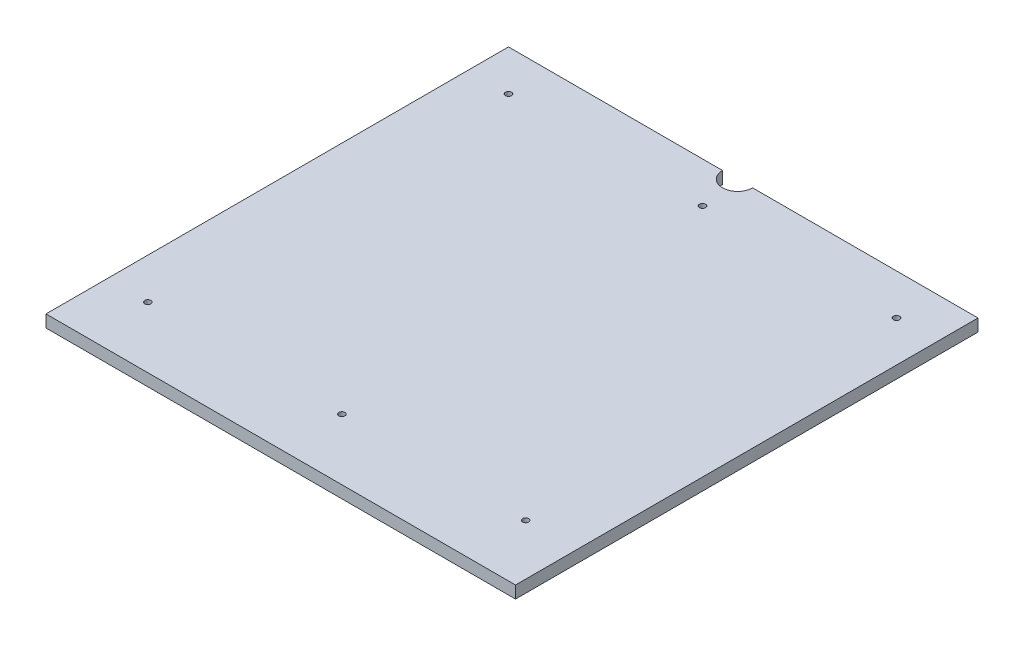
ISO-10303-21;
HEADER;
FILE_DESCRIPTION(('STEP AP214'),'2;1');
FILE_NAME('part.step','',(''),(''),'','','');
FILE_SCHEMA(('AUTOMOTIVE_DESIGN { 1 0 10303 214 1 1 1 1 }'));
ENDSEC;
DATA;
#1=APPLICATION_CONTEXT('core data for automotive mechanical design processes');
#2=APPLICATION_PROTOCOL_DEFINITION('international standard','automotive_design',2000,#1);
#3=PRODUCT_CONTEXT('',#1,'mechanical');
#4=PRODUCT('Part','Part','',(#3));
#5=PRODUCT_RELATED_PRODUCT_CATEGORY('part','',(#4));
#6=PRODUCT_DEFINITION_FORMATION('','',#4);
#7=PRODUCT_DEFINITION_CONTEXT('part definition',#1,'design');
#8=PRODUCT_DEFINITION('design','',#6,#7);
#9=PRODUCT_DEFINITION_SHAPE('','',#8);
#10=(LENGTH_UNIT() NAMED_UNIT(*) SI_UNIT(.MILLI.,.METRE.));
#11=(NAMED_UNIT(*) PLANE_ANGLE_UNIT() SI_UNIT($,.RADIAN.));
#12=(NAMED_UNIT(*) SI_UNIT($,.STERADIAN.) SOLID_ANGLE_UNIT());
#13=UNCERTAINTY_MEASURE_WITH_UNIT(LENGTH_MEASURE(1.E-05),#10,'distance_accuracy_value','');
#14=(GEOMETRIC_REPRESENTATION_CONTEXT(3) GLOBAL_UNCERTAINTY_ASSIGNED_CONTEXT((#13)) GLOBAL_UNIT_ASSIGNED_CONTEXT((#10,
#11,#12)) REPRESENTATION_CONTEXT('',''));
#15=CARTESIAN_POINT('',(0.,0.,0.));
#16=DIRECTION('',(0.,0.,1.));
#17=DIRECTION('',(1.,0.,0.));
#18=AXIS2_PLACEMENT_3D('',#15,#16,#17);
#19=CARTESIAN_POINT('',(-0.280000000000012,6.,-113.5));
#20=DIRECTION('',(0.,1.,0.));
#21=DIRECTION('',(0.,0.,1.));
#22=AXIS2_PLACEMENT_3D('',#19,#20,#21);
#23=PLANE('',#22);
#24=CARTESIAN_POINT('',(2.50000000000002,6.,83.5));
#25=DIRECTION('',(0.,1.,0.));
#26=DIRECTION('',(0.,0.,1.));
#27=AXIS2_PLACEMENT_3D('',#24,#25,#26);
#28=CIRCLE('',#27,1.5);
#29=CARTESIAN_POINT('',(2.50000000000002,6.,85.));
#30=VERTEX_POINT('',#29);
#31=EDGE_CURVE('E220',#30,#30,#28,.T.);
#32=ORIENTED_EDGE('',*,*,#31,.F.);
#33=EDGE_LOOP('',(#32));
#34=FACE_BOUND('',#33,.T.);
#35=CARTESIAN_POINT('',(2.49999999999999,6.,-93.5));
#36=DIRECTION('',(0.,1.,0.));
#37=DIRECTION('',(0.,0.,1.));
#38=AXIS2_PLACEMENT_3D('',#35,#36,#37);
#39=CIRCLE('',#38,1.5);
#40=CARTESIAN_POINT('',(2.49999999999999,6.,-92.));
#41=VERTEX_POINT('',#40);
#42=EDGE_CURVE('E236',#41,#41,#39,.T.);
#43=ORIENTED_EDGE('',*,*,#42,.F.);
#44=EDGE_LOOP('',(#43));
#45=FACE_BOUND('',#44,.T.);
#46=CARTESIAN_POINT('',(-92.725,6.,-93.5));
#47=DIRECTION('',(0.,1.,0.));
#48=DIRECTION('',(0.,0.,1.));
#49=AXIS2_PLACEMENT_3D('',#46,#47,#48);
#50=CIRCLE('',#49,1.5);
#51=CARTESIAN_POINT('',(-92.725,6.,-92.));
#52=VERTEX_POINT('',#51);
#53=EDGE_CURVE('E133',#52,#52,#50,.T.);
#54=ORIENTED_EDGE('',*,*,#53,.F.);
#55=EDGE_LOOP('',(#54));
#56=FACE_BOUND('',#55,.T.);
#57=DIRECTION('',(0.,0.,1.));
#58=VECTOR('',#57,1.);
#59=CARTESIAN_POINT('',(-112.725,6.,-113.5));
#60=LINE('',#59,#58);
#61=CARTESIAN_POINT('',(-112.725,6.,-113.5));
#62=VERTEX_POINT('',#61);
#63=CARTESIAN_POINT('',(-112.725,6.,113.5));
#64=VERTEX_POINT('',#63);
#65=EDGE_CURVE('E146',#62,#64,#60,.T.);
#66=ORIENTED_EDGE('',*,*,#65,.T.);
#67=DIRECTION('',(1.,0.,0.));
#68=VECTOR('',#67,1.);
#69=CARTESIAN_POINT('',(-112.725,6.,113.5));
#70=LINE('',#69,#68);
#71=CARTESIAN_POINT('',(117.725,6.,113.5));
#72=VERTEX_POINT('',#71);
#73=EDGE_CURVE('E94',#64,#72,#70,.T.);
#74=ORIENTED_EDGE('',*,*,#73,.T.);
#75=DIRECTION('',(0.,0.,-1.));
#76=VECTOR('',#75,1.);
#77=CARTESIAN_POINT('',(117.725,6.,-113.5));
#78=LINE('',#77,#76);
#79=CARTESIAN_POINT('',(117.725,6.,-113.5));
#80=VERTEX_POINT('',#79);
#81=EDGE_CURVE('E107',#72,#80,#78,.T.);
#82=ORIENTED_EDGE('',*,*,#81,.T.);
#83=DIRECTION('',(-1.,0.,0.));
#84=VECTOR('',#83,1.);
#85=CARTESIAN_POINT('',(7.49999999999999,6.,-113.5));
#86=LINE('',#85,#84);
#87=CARTESIAN_POINT('',(7.10255217346666,6.,-113.5));
#88=VERTEX_POINT('',#87);
#89=EDGE_CURVE('E101',#80,#88,#86,.T.);
#90=ORIENTED_EDGE('',*,*,#89,.T.);
#91=CARTESIAN_POINT('',(-0.280000000000012,6.,-113.5));
#92=DIRECTION('',(0.,-1.,0.));
#93=DIRECTION('',(0.,0.,1.));
#94=AXIS2_PLACEMENT_3D('',#91,#92,#93);
#95=CIRCLE('',#94,7.38255217346668);
#96=CARTESIAN_POINT('',(-7.66255217346669,6.,-113.5));
#97=VERTEX_POINT('',#96);
#98=EDGE_CURVE('E105',#88,#97,#95,.T.);
#99=ORIENTED_EDGE('',*,*,#98,.T.);
#100=DIRECTION('',(-1.,0.,0.));
#101=VECTOR('',#100,1.);
#102=CARTESIAN_POINT('',(-112.725,6.,-113.5));
#103=LINE('',#102,#101);
#104=EDGE_CURVE('E57',#97,#62,#103,.T.);
#105=ORIENTED_EDGE('',*,*,#104,.T.);
#106=EDGE_LOOP('',(#66,#74,#82,#90,#99,#105));
#107=FACE_BOUND('',#106,.T.);
#108=CARTESIAN_POINT('',(97.725,6.,-93.5));
#109=DIRECTION('',(0.,1.,0.));
#110=DIRECTION('',(0.,0.,1.));
#111=AXIS2_PLACEMENT_3D('',#108,#109,#110);
#112=CIRCLE('',#111,1.5);
#113=CARTESIAN_POINT('',(97.725,6.,-92.));
#114=VERTEX_POINT('',#113);
#115=EDGE_CURVE('E244',#114,#114,#112,.T.);
#116=ORIENTED_EDGE('',*,*,#115,.F.);
#117=EDGE_LOOP('',(#116));
#118=FACE_BOUND('',#117,.T.);
#119=CARTESIAN_POINT('',(-92.725,6.,83.5));
#120=DIRECTION('',(0.,1.,0.));
#121=DIRECTION('',(0.,0.,1.));
#122=AXIS2_PLACEMENT_3D('',#119,#120,#121);
#123=CIRCLE('',#122,1.5);
#124=CARTESIAN_POINT('',(-92.725,6.,85.));
#125=VERTEX_POINT('',#124);
#126=EDGE_CURVE('E228',#125,#125,#123,.T.);
#127=ORIENTED_EDGE('',*,*,#126,.F.);
#128=EDGE_LOOP('',(#127));
#129=FACE_BOUND('',#128,.T.);
#130=CARTESIAN_POINT('',(92.725,6.,83.5));
#131=DIRECTION('',(0.,1.,0.));
#132=DIRECTION('',(0.,0.,1.));
#133=AXIS2_PLACEMENT_3D('',#130,#131,#132);
#134=CIRCLE('',#133,1.5);
#135=CARTESIAN_POINT('',(92.725,6.,85.));
#136=VERTEX_POINT('',#135);
#137=EDGE_CURVE('E209',#136,#136,#134,.T.);
#138=ORIENTED_EDGE('',*,*,#137,.F.);
#139=EDGE_LOOP('',(#138));
#140=FACE_BOUND('',#139,.T.);
#141=ADVANCED_FACE('F39',(#34,#45,#56,#107,#118,#129,#140),#23,.T.);
#142=CARTESIAN_POINT('',(-0.280000000000012,0.,-113.5));
#143=DIRECTION('',(0.,1.,0.));
#144=DIRECTION('',(0.,0.,1.));
#145=AXIS2_PLACEMENT_3D('',#142,#143,#144);
#146=PLANE('',#145);
#147=DIRECTION('',(0.,0.,1.));
#148=VECTOR('',#147,1.);
#149=CARTESIAN_POINT('',(-112.725,0.,-113.5));
#150=LINE('',#149,#148);
#151=CARTESIAN_POINT('',(-112.725,0.,-113.5));
#152=VERTEX_POINT('',#151);
#153=CARTESIAN_POINT('',(-112.725,0.,113.5));
#154=VERTEX_POINT('',#153);
#155=EDGE_CURVE('E128',#152,#154,#150,.T.);
#156=ORIENTED_EDGE('',*,*,#155,.F.);
#157=DIRECTION('',(-1.,0.,0.));
#158=VECTOR('',#157,1.);
#159=CARTESIAN_POINT('',(-112.725,0.,-113.5));
#160=LINE('',#159,#158);
#161=CARTESIAN_POINT('',(-7.66255217346669,0.,-113.5));
#162=VERTEX_POINT('',#161);
#163=EDGE_CURVE('E86',#162,#152,#160,.T.);
#164=ORIENTED_EDGE('',*,*,#163,.F.);
#165=CARTESIAN_POINT('',(-0.280000000000012,0.,-113.5));
#166=DIRECTION('',(0.,-1.,0.));
#167=DIRECTION('',(0.,0.,1.));
#168=AXIS2_PLACEMENT_3D('',#165,#166,#167);
#169=CIRCLE('',#168,7.38255217346668);
#170=CARTESIAN_POINT('',(7.10255217346666,0.,-113.5));
#171=VERTEX_POINT('',#170);
#172=EDGE_CURVE('E80',#171,#162,#169,.T.);
#173=ORIENTED_EDGE('',*,*,#172,.F.);
#174=DIRECTION('',(-1.,0.,0.));
#175=VECTOR('',#174,1.);
#176=CARTESIAN_POINT('',(7.10255217346666,0.,-113.5));
#177=LINE('',#176,#175);
#178=CARTESIAN_POINT('',(117.725,0.,-113.5));
#179=VERTEX_POINT('',#178);
#180=EDGE_CURVE('E115',#179,#171,#177,.T.);
#181=ORIENTED_EDGE('',*,*,#180,.F.);
#182=DIRECTION('',(0.,0.,-1.));
#183=VECTOR('',#182,1.);
#184=CARTESIAN_POINT('',(117.725,0.,-113.5));
#185=LINE('',#184,#183);
#186=CARTESIAN_POINT('',(117.725,0.,113.5));
#187=VERTEX_POINT('',#186);
#188=EDGE_CURVE('E136',#187,#179,#185,.T.);
#189=ORIENTED_EDGE('',*,*,#188,.F.);
#190=DIRECTION('',(1.,0.,0.));
#191=VECTOR('',#190,1.);
#192=CARTESIAN_POINT('',(-112.725,0.,113.5));
#193=LINE('',#192,#191);
#194=EDGE_CURVE('E132',#154,#187,#193,.T.);
#195=ORIENTED_EDGE('',*,*,#194,.F.);
#196=EDGE_LOOP('',(#156,#164,#173,#181,#189,#195));
#197=FACE_BOUND('',#196,.T.);
#198=CARTESIAN_POINT('',(-92.725,0.,-93.5));
#199=DIRECTION('',(0.,1.,0.));
#200=DIRECTION('',(0.,0.,1.));
#201=AXIS2_PLACEMENT_3D('',#198,#199,#200);
#202=CIRCLE('',#201,1.5);
#203=CARTESIAN_POINT('',(-92.725,0.,-92.));
#204=VERTEX_POINT('',#203);
#205=EDGE_CURVE('E248',#204,#204,#202,.T.);
#206=ORIENTED_EDGE('',*,*,#205,.T.);
#207=EDGE_LOOP('',(#206));
#208=FACE_BOUND('',#207,.T.);
#209=CARTESIAN_POINT('',(97.725,0.,-93.5));
#210=DIRECTION('',(0.,1.,0.));
#211=DIRECTION('',(0.,0.,1.));
#212=AXIS2_PLACEMENT_3D('',#209,#210,#211);
#213=CIRCLE('',#212,1.5);
#214=CARTESIAN_POINT('',(97.725,0.,-92.));
#215=VERTEX_POINT('',#214);
#216=EDGE_CURVE('E240',#215,#215,#213,.T.);
#217=ORIENTED_EDGE('',*,*,#216,.T.);
#218=EDGE_LOOP('',(#217));
#219=FACE_BOUND('',#218,.T.);
#220=CARTESIAN_POINT('',(2.49999999999999,0.,-93.5));
#221=DIRECTION('',(0.,1.,0.));
#222=DIRECTION('',(0.,0.,1.));
#223=AXIS2_PLACEMENT_3D('',#220,#221,#222);
#224=CIRCLE('',#223,1.5);
#225=CARTESIAN_POINT('',(2.49999999999999,0.,-92.));
#226=VERTEX_POINT('',#225);
#227=EDGE_CURVE('E232',#226,#226,#224,.T.);
#228=ORIENTED_EDGE('',*,*,#227,.T.);
#229=EDGE_LOOP('',(#228));
#230=FACE_BOUND('',#229,.T.);
#231=CARTESIAN_POINT('',(-92.725,0.,83.5));
#232=DIRECTION('',(0.,1.,0.));
#233=DIRECTION('',(0.,0.,1.));
#234=AXIS2_PLACEMENT_3D('',#231,#232,#233);
#235=CIRCLE('',#234,1.5);
#236=CARTESIAN_POINT('',(-92.725,0.,85.));
#237=VERTEX_POINT('',#236);
#238=EDGE_CURVE('E224',#237,#237,#235,.T.);
#239=ORIENTED_EDGE('',*,*,#238,.T.);
#240=EDGE_LOOP('',(#239));
#241=FACE_BOUND('',#240,.T.);
#242=CARTESIAN_POINT('',(2.50000000000002,0.,83.5));
#243=DIRECTION('',(0.,1.,0.));
#244=DIRECTION('',(0.,0.,1.));
#245=AXIS2_PLACEMENT_3D('',#242,#243,#244);
#246=CIRCLE('',#245,1.5);
#247=CARTESIAN_POINT('',(2.50000000000002,0.,85.));
#248=VERTEX_POINT('',#247);
#249=EDGE_CURVE('E217',#248,#248,#246,.T.);
#250=ORIENTED_EDGE('',*,*,#249,.T.);
#251=EDGE_LOOP('',(#250));
#252=FACE_BOUND('',#251,.T.);
#253=CARTESIAN_POINT('',(92.725,0.,83.5));
#254=DIRECTION('',(0.,1.,0.));
#255=DIRECTION('',(0.,0.,1.));
#256=AXIS2_PLACEMENT_3D('',#253,#254,#255);
#257=CIRCLE('',#256,1.5);
#258=CARTESIAN_POINT('',(92.725,0.,85.));
#259=VERTEX_POINT('',#258);
#260=EDGE_CURVE('E212',#259,#259,#257,.T.);
#261=ORIENTED_EDGE('',*,*,#260,.T.);
#262=EDGE_LOOP('',(#261));
#263=FACE_BOUND('',#262,.T.);
#264=ADVANCED_FACE('F159',(#197,#208,#219,#230,#241,#252,#263),#146,.F.);
#265=CARTESIAN_POINT('',(-112.725,6.,-113.5));
#266=DIRECTION('',(1.,0.,0.));
#267=DIRECTION('',(0.,0.,-1.));
#268=AXIS2_PLACEMENT_3D('',#265,#266,#267);
#269=PLANE('',#268);
#270=ORIENTED_EDGE('',*,*,#155,.T.);
#271=DIRECTION('',(0.,-1.,0.));
#272=VECTOR('',#271,1.);
#273=CARTESIAN_POINT('',(-112.725,6.,113.5));
#274=LINE('',#273,#272);
#275=EDGE_CURVE('E11',#64,#154,#274,.T.);
#276=ORIENTED_EDGE('',*,*,#275,.F.);
#277=ORIENTED_EDGE('',*,*,#65,.F.);
#278=DIRECTION('',(0.,-1.,0.));
#279=VECTOR('',#278,1.);
#280=CARTESIAN_POINT('',(-112.725,6.,-113.5));
#281=LINE('',#280,#279);
#282=EDGE_CURVE('E124',#62,#152,#281,.T.);
#283=ORIENTED_EDGE('',*,*,#282,.T.);
#284=EDGE_LOOP('',(#270,#276,#277,#283));
#285=FACE_BOUND('',#284,.T.);
#286=ADVANCED_FACE('F41',(#285),#269,.F.);
#287=CARTESIAN_POINT('',(-112.725,6.,113.5));
#288=DIRECTION('',(0.,0.,-1.));
#289=DIRECTION('',(-1.,0.,0.));
#290=AXIS2_PLACEMENT_3D('',#287,#288,#289);
#291=PLANE('',#290);
#292=ORIENTED_EDGE('',*,*,#194,.T.);
#293=DIRECTION('',(0.,-1.,0.));
#294=VECTOR('',#293,1.);
#295=CARTESIAN_POINT('',(117.725,6.,113.5));
#296=LINE('',#295,#294);
#297=EDGE_CURVE('E49',#72,#187,#296,.T.);
#298=ORIENTED_EDGE('',*,*,#297,.F.);
#299=ORIENTED_EDGE('',*,*,#73,.F.);
#300=ORIENTED_EDGE('',*,*,#275,.T.);
#301=EDGE_LOOP('',(#292,#298,#299,#300));
#302=FACE_BOUND('',#301,.T.);
#303=ADVANCED_FACE('F331',(#302),#291,.F.);
#304=CARTESIAN_POINT('',(117.725,6.,-113.5));
#305=DIRECTION('',(-1.,0.,0.));
#306=DIRECTION('',(0.,0.,1.));
#307=AXIS2_PLACEMENT_3D('',#304,#305,#306);
#308=PLANE('',#307);
#309=ORIENTED_EDGE('',*,*,#188,.T.);
#310=DIRECTION('',(0.,-1.,0.));
#311=VECTOR('',#310,1.);
#312=CARTESIAN_POINT('',(117.725,6.,-113.5));
#313=LINE('',#312,#311);
#314=EDGE_CURVE('E117',#80,#179,#313,.T.);
#315=ORIENTED_EDGE('',*,*,#314,.F.);
#316=ORIENTED_EDGE('',*,*,#81,.F.);
#317=ORIENTED_EDGE('',*,*,#297,.T.);
#318=EDGE_LOOP('',(#309,#315,#316,#317));
#319=FACE_BOUND('',#318,.T.);
#320=ADVANCED_FACE('F156',(#319),#308,.F.);
#321=CARTESIAN_POINT('',(7.10255217346666,6.,-113.5));
#322=DIRECTION('',(0.,0.,1.));
#323=DIRECTION('',(1.,0.,0.));
#324=AXIS2_PLACEMENT_3D('',#321,#322,#323);
#325=PLANE('',#324);
#326=ORIENTED_EDGE('',*,*,#180,.T.);
#327=DIRECTION('',(0.,-1.,0.));
#328=VECTOR('',#327,1.);
#329=CARTESIAN_POINT('',(7.10255217346666,6.,-113.5));
#330=LINE('',#329,#328);
#331=EDGE_CURVE('E113',#88,#171,#330,.T.);
#332=ORIENTED_EDGE('',*,*,#331,.F.);
#333=ORIENTED_EDGE('',*,*,#89,.F.);
#334=ORIENTED_EDGE('',*,*,#314,.T.);
#335=EDGE_LOOP('',(#326,#332,#333,#334));
#336=FACE_BOUND('',#335,.T.);
#337=ADVANCED_FACE('F114',(#336),#325,.F.);
#338=CARTESIAN_POINT('',(-0.280000000000012,6.,-113.5));
#339=DIRECTION('',(0.,-1.,0.));
#340=DIRECTION('',(0.,0.,-1.));
#341=AXIS2_PLACEMENT_3D('',#338,#339,#340);
#342=CYLINDRICAL_SURFACE('',#341,7.38255217346668);
#343=ORIENTED_EDGE('',*,*,#172,.T.);
#344=DIRECTION('',(0.,-1.,0.));
#345=VECTOR('',#344,1.);
#346=CARTESIAN_POINT('',(-7.66255217346669,6.,-113.5));
#347=LINE('',#346,#345);
#348=EDGE_CURVE('E118',#97,#162,#347,.T.);
#349=ORIENTED_EDGE('',*,*,#348,.F.);
#350=ORIENTED_EDGE('',*,*,#98,.F.);
#351=ORIENTED_EDGE('',*,*,#331,.T.);
#352=EDGE_LOOP('',(#343,#349,#350,#351));
#353=FACE_BOUND('',#352,.T.);
#354=ADVANCED_FACE('F120',(#353),#342,.F.);
#355=CARTESIAN_POINT('',(-112.725,6.,-113.5));
#356=DIRECTION('',(0.,0.,1.));
#357=DIRECTION('',(1.,0.,0.));
#358=AXIS2_PLACEMENT_3D('',#355,#356,#357);
#359=PLANE('',#358);
#360=ORIENTED_EDGE('',*,*,#163,.T.);
#361=ORIENTED_EDGE('',*,*,#282,.F.);
#362=ORIENTED_EDGE('',*,*,#104,.F.);
#363=ORIENTED_EDGE('',*,*,#348,.T.);
#364=EDGE_LOOP('',(#360,#361,#362,#363));
#365=FACE_BOUND('',#364,.T.);
#366=ADVANCED_FACE('F164',(#365),#359,.F.);
#367=CARTESIAN_POINT('',(-92.725,6.,-93.5));
#368=DIRECTION('',(0.,-1.,0.));
#369=DIRECTION('',(0.,0.,-1.));
#370=AXIS2_PLACEMENT_3D('',#367,#368,#369);
#371=CYLINDRICAL_SURFACE('',#370,1.5);
#372=ORIENTED_EDGE('',*,*,#53,.T.);
#373=EDGE_LOOP('',(#372));
#374=FACE_BOUND('',#373,.T.);
#375=ORIENTED_EDGE('',*,*,#205,.F.);
#376=EDGE_LOOP('',(#375));
#377=FACE_BOUND('',#376,.T.);
#378=ADVANCED_FACE('F166',(#374,#377),#371,.F.);
#379=CARTESIAN_POINT('',(97.725,6.,-93.5));
#380=DIRECTION('',(0.,-1.,0.));
#381=DIRECTION('',(0.,0.,-1.));
#382=AXIS2_PLACEMENT_3D('',#379,#380,#381);
#383=CYLINDRICAL_SURFACE('',#382,1.5);
#384=ORIENTED_EDGE('',*,*,#115,.T.);
#385=EDGE_LOOP('',(#384));
#386=FACE_BOUND('',#385,.T.);
#387=ORIENTED_EDGE('',*,*,#216,.F.);
#388=EDGE_LOOP('',(#387));
#389=FACE_BOUND('',#388,.T.);
#390=ADVANCED_FACE('F172',(#386,#389),#383,.F.);
#391=CARTESIAN_POINT('',(2.49999999999999,6.,-93.5));
#392=DIRECTION('',(0.,-1.,0.));
#393=DIRECTION('',(0.,0.,-1.));
#394=AXIS2_PLACEMENT_3D('',#391,#392,#393);
#395=CYLINDRICAL_SURFACE('',#394,1.5);
#396=ORIENTED_EDGE('',*,*,#42,.T.);
#397=EDGE_LOOP('',(#396));
#398=FACE_BOUND('',#397,.T.);
#399=ORIENTED_EDGE('',*,*,#227,.F.);
#400=EDGE_LOOP('',(#399));
#401=FACE_BOUND('',#400,.T.);
#402=ADVANCED_FACE('F188',(#398,#401),#395,.F.);
#403=CARTESIAN_POINT('',(-92.725,6.,83.5));
#404=DIRECTION('',(0.,-1.,0.));
#405=DIRECTION('',(0.,0.,-1.));
#406=AXIS2_PLACEMENT_3D('',#403,#404,#405);
#407=CYLINDRICAL_SURFACE('',#406,1.5);
#408=ORIENTED_EDGE('',*,*,#126,.T.);
#409=EDGE_LOOP('',(#408));
#410=FACE_BOUND('',#409,.T.);
#411=ORIENTED_EDGE('',*,*,#238,.F.);
#412=EDGE_LOOP('',(#411));
#413=FACE_BOUND('',#412,.T.);
#414=ADVANCED_FACE('F192',(#410,#413),#407,.F.);
#415=CARTESIAN_POINT('',(2.50000000000002,6.,83.5));
#416=DIRECTION('',(0.,-1.,0.));
#417=DIRECTION('',(0.,0.,-1.));
#418=AXIS2_PLACEMENT_3D('',#415,#416,#417);
#419=CYLINDRICAL_SURFACE('',#418,1.5);
#420=ORIENTED_EDGE('',*,*,#31,.T.);
#421=EDGE_LOOP('',(#420));
#422=FACE_BOUND('',#421,.T.);
#423=ORIENTED_EDGE('',*,*,#249,.F.);
#424=EDGE_LOOP('',(#423));
#425=FACE_BOUND('',#424,.T.);
#426=ADVANCED_FACE('F196',(#422,#425),#419,.F.);
#427=CARTESIAN_POINT('',(92.725,6.,83.5));
#428=DIRECTION('',(0.,-1.,0.));
#429=DIRECTION('',(0.,0.,-1.));
#430=AXIS2_PLACEMENT_3D('',#427,#428,#429);
#431=CYLINDRICAL_SURFACE('',#430,1.5);
#432=ORIENTED_EDGE('',*,*,#137,.T.);
#433=EDGE_LOOP('',(#432));
#434=FACE_BOUND('',#433,.T.);
#435=ORIENTED_EDGE('',*,*,#260,.F.);
#436=EDGE_LOOP('',(#435));
#437=FACE_BOUND('',#436,.T.);
#438=ADVANCED_FACE('F200',(#434,#437),#431,.F.);
#439=CLOSED_SHELL('',(#141,#264,#286,#303,#320,#337,#354,#366,#378,#390,#402,#414,#426,#438));
#440=MANIFOLD_SOLID_BREP('B2',#439);
#441=ADVANCED_BREP_SHAPE_REPRESENTATION('',(#18,#440),#14);
#442=SHAPE_DEFINITION_REPRESENTATION(#9,#441);
ENDSEC;
END-ISO-10303-21;
